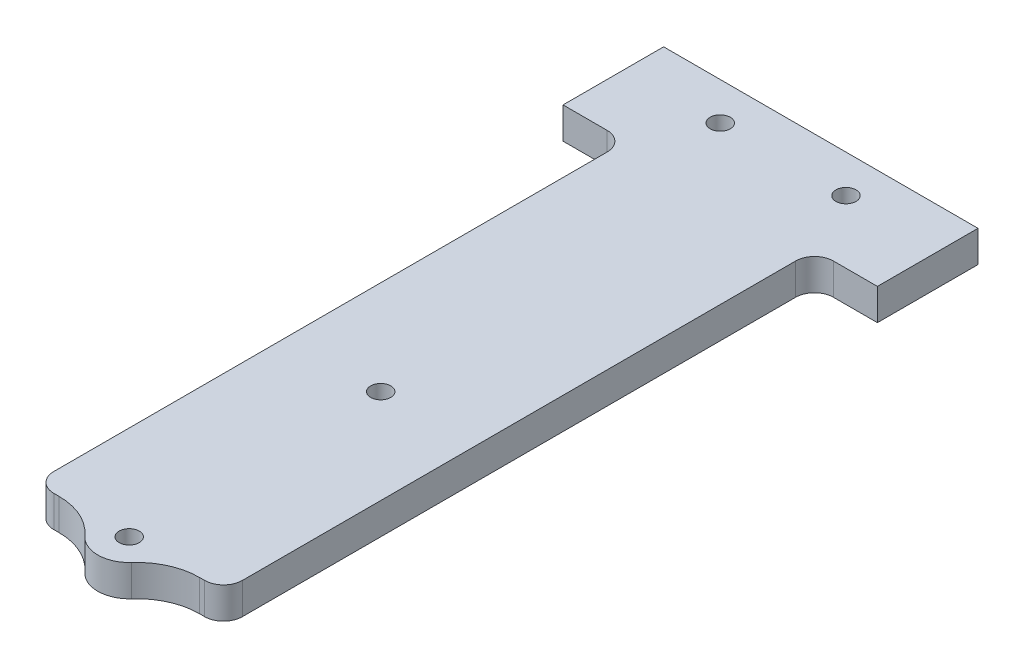
ISO-10303-21;
HEADER;
FILE_DESCRIPTION(('STEP AP214'),'2;1');
FILE_NAME('part.step','',(''),(''),'','','');
FILE_SCHEMA(('AUTOMOTIVE_DESIGN { 1 0 10303 214 1 1 1 1 }'));
ENDSEC;
DATA;
#1=APPLICATION_CONTEXT('core data for automotive mechanical design processes');
#2=APPLICATION_PROTOCOL_DEFINITION('international standard','automotive_design',2000,#1);
#3=PRODUCT_CONTEXT('',#1,'mechanical');
#4=PRODUCT('Part','Part','',(#3));
#5=PRODUCT_RELATED_PRODUCT_CATEGORY('part','',(#4));
#6=PRODUCT_DEFINITION_FORMATION('','',#4);
#7=PRODUCT_DEFINITION_CONTEXT('part definition',#1,'design');
#8=PRODUCT_DEFINITION('design','',#6,#7);
#9=PRODUCT_DEFINITION_SHAPE('','',#8);
#10=(LENGTH_UNIT() NAMED_UNIT(*) SI_UNIT(.MILLI.,.METRE.));
#11=(NAMED_UNIT(*) PLANE_ANGLE_UNIT() SI_UNIT($,.RADIAN.));
#12=(NAMED_UNIT(*) SI_UNIT($,.STERADIAN.) SOLID_ANGLE_UNIT());
#13=UNCERTAINTY_MEASURE_WITH_UNIT(LENGTH_MEASURE(1.E-05),#10,'distance_accuracy_value','');
#14=(GEOMETRIC_REPRESENTATION_CONTEXT(3) GLOBAL_UNCERTAINTY_ASSIGNED_CONTEXT((#13)) GLOBAL_UNIT_ASSIGNED_CONTEXT((#10,
#11,#12)) REPRESENTATION_CONTEXT('',''));
#15=CARTESIAN_POINT('',(0.,0.,0.));
#16=DIRECTION('',(0.,0.,1.));
#17=DIRECTION('',(1.,0.,0.));
#18=AXIS2_PLACEMENT_3D('',#15,#16,#17);
#19=CARTESIAN_POINT('',(0.,5.,0.));
#20=DIRECTION('',(1.,0.,0.));
#21=DIRECTION('',(0.,0.,-1.));
#22=AXIS2_PLACEMENT_3D('',#19,#20,#21);
#23=PLANE('',#22);
#24=DIRECTION('',(0.,0.,1.));
#25=VECTOR('',#24,1.);
#26=CARTESIAN_POINT('',(0.,5.,0.));
#27=LINE('',#26,#25);
#28=CARTESIAN_POINT('',(0.,5.,-91.));
#29=VERTEX_POINT('',#28);
#30=CARTESIAN_POINT('',(0.,5.,-3.));
#31=VERTEX_POINT('',#30);
#32=EDGE_CURVE('E58',#29,#31,#27,.T.);
#33=ORIENTED_EDGE('',*,*,#32,.F.);
#34=DIRECTION('',(0.,1.,0.));
#35=VECTOR('',#34,1.);
#36=CARTESIAN_POINT('',(0.,0.,-91.));
#37=LINE('',#36,#35);
#38=CARTESIAN_POINT('',(0.,0.,-91.));
#39=VERTEX_POINT('',#38);
#40=EDGE_CURVE('E271',#29,#39,#37,.F.);
#41=ORIENTED_EDGE('',*,*,#40,.T.);
#42=DIRECTION('',(0.,0.,1.));
#43=VECTOR('',#42,1.);
#44=CARTESIAN_POINT('',(0.,0.,0.));
#45=LINE('',#44,#43);
#46=CARTESIAN_POINT('',(0.,0.,-3.));
#47=VERTEX_POINT('',#46);
#48=EDGE_CURVE('E188',#39,#47,#45,.T.);
#49=ORIENTED_EDGE('',*,*,#48,.T.);
#50=DIRECTION('',(0.,-1.,0.));
#51=VECTOR('',#50,1.);
#52=CARTESIAN_POINT('',(0.,5.,-3.));
#53=LINE('',#52,#51);
#54=EDGE_CURVE('E268',#47,#31,#53,.F.);
#55=ORIENTED_EDGE('',*,*,#54,.T.);
#56=EDGE_LOOP('',(#33,#41,#49,#55));
#57=FACE_BOUND('',#56,.T.);
#58=ADVANCED_FACE('F42',(#57),#23,.F.);
#59=CARTESIAN_POINT('',(30.,5.,0.));
#60=DIRECTION('',(-1.,0.,0.));
#61=DIRECTION('',(0.,0.,1.));
#62=AXIS2_PLACEMENT_3D('',#59,#60,#61);
#63=PLANE('',#62);
#64=DIRECTION('',(0.,0.,-1.));
#65=VECTOR('',#64,1.);
#66=CARTESIAN_POINT('',(30.,5.,0.));
#67=LINE('',#66,#65);
#68=CARTESIAN_POINT('',(30.,5.,-3.));
#69=VERTEX_POINT('',#68);
#70=CARTESIAN_POINT('',(30.,5.,-91.));
#71=VERTEX_POINT('',#70);
#72=EDGE_CURVE('E202',#69,#71,#67,.T.);
#73=ORIENTED_EDGE('',*,*,#72,.F.);
#74=DIRECTION('',(0.,-1.,0.));
#75=VECTOR('',#74,1.);
#76=CARTESIAN_POINT('',(30.,5.,-3.));
#77=LINE('',#76,#75);
#78=CARTESIAN_POINT('',(30.,0.,-3.));
#79=VERTEX_POINT('',#78);
#80=EDGE_CURVE('E257',#69,#79,#77,.T.);
#81=ORIENTED_EDGE('',*,*,#80,.T.);
#82=DIRECTION('',(0.,0.,-1.));
#83=VECTOR('',#82,1.);
#84=CARTESIAN_POINT('',(30.,0.,0.));
#85=LINE('',#84,#83);
#86=CARTESIAN_POINT('',(30.,0.,-91.));
#87=VERTEX_POINT('',#86);
#88=EDGE_CURVE('E214',#79,#87,#85,.T.);
#89=ORIENTED_EDGE('',*,*,#88,.T.);
#90=DIRECTION('',(0.,-1.,0.));
#91=VECTOR('',#90,1.);
#92=CARTESIAN_POINT('',(30.,5.,-91.));
#93=LINE('',#92,#91);
#94=EDGE_CURVE('E261',#87,#71,#93,.F.);
#95=ORIENTED_EDGE('',*,*,#94,.T.);
#96=EDGE_LOOP('',(#73,#81,#89,#95));
#97=FACE_BOUND('',#96,.T.);
#98=ADVANCED_FACE('F343',(#97),#63,.F.);
#99=CARTESIAN_POINT('',(0.,5.,0.));
#100=DIRECTION('',(0.,-1.,0.));
#101=DIRECTION('',(0.,0.,-1.));
#102=AXIS2_PLACEMENT_3D('',#99,#100,#101);
#103=PLANE('',#102);
#104=DIRECTION('',(0.,0.,-1.));
#105=VECTOR('',#104,1.);
#106=CARTESIAN_POINT('',(40.,5.,-94.));
#107=LINE('',#106,#105);
#108=CARTESIAN_POINT('',(40.,5.,-94.));
#109=VERTEX_POINT('',#108);
#110=CARTESIAN_POINT('',(40.,5.,-110.));
#111=VERTEX_POINT('',#110);
#112=EDGE_CURVE('E156',#109,#111,#107,.T.);
#113=ORIENTED_EDGE('',*,*,#112,.T.);
#114=DIRECTION('',(1.,0.,0.));
#115=VECTOR('',#114,1.);
#116=CARTESIAN_POINT('',(-10.,5.,-110.));
#117=LINE('',#116,#115);
#118=CARTESIAN_POINT('',(-10.,5.,-110.));
#119=VERTEX_POINT('',#118);
#120=EDGE_CURVE('E161',#119,#111,#117,.T.);
#121=ORIENTED_EDGE('',*,*,#120,.F.);
#122=DIRECTION('',(0.,0.,-1.));
#123=VECTOR('',#122,1.);
#124=CARTESIAN_POINT('',(-10.,5.,-94.));
#125=LINE('',#124,#123);
#126=CARTESIAN_POINT('',(-10.,5.,-94.));
#127=VERTEX_POINT('',#126);
#128=EDGE_CURVE('E168',#127,#119,#125,.T.);
#129=ORIENTED_EDGE('',*,*,#128,.F.);
#130=DIRECTION('',(-1.,0.,0.));
#131=VECTOR('',#130,1.);
#132=CARTESIAN_POINT('',(-10.,5.,-94.));
#133=LINE('',#132,#131);
#134=CARTESIAN_POINT('',(-3.,5.,-94.));
#135=VERTEX_POINT('',#134);
#136=EDGE_CURVE('E296',#135,#127,#133,.T.);
#137=ORIENTED_EDGE('',*,*,#136,.F.);
#138=CARTESIAN_POINT('',(-3.,5.,-91.));
#139=DIRECTION('',(0.,-1.,0.));
#140=DIRECTION('',(0.,0.,-1.));
#141=AXIS2_PLACEMENT_3D('',#138,#139,#140);
#142=CIRCLE('',#141,3.);
#143=EDGE_CURVE('E51',#135,#29,#142,.T.);
#144=ORIENTED_EDGE('',*,*,#143,.T.);
#145=ORIENTED_EDGE('',*,*,#32,.T.);
#146=CARTESIAN_POINT('',(3.,5.,-3.));
#147=DIRECTION('',(0.,-1.,0.));
#148=DIRECTION('',(0.,0.,-1.));
#149=AXIS2_PLACEMENT_3D('',#146,#147,#148);
#150=CIRCLE('',#149,3.);
#151=CARTESIAN_POINT('',(3.,5.,0.));
#152=VERTEX_POINT('',#151);
#153=EDGE_CURVE('E251',#31,#152,#150,.F.);
#154=ORIENTED_EDGE('',*,*,#153,.T.);
#155=DIRECTION('',(1.,0.,0.));
#156=VECTOR('',#155,1.);
#157=CARTESIAN_POINT('',(0.,5.,0.));
#158=LINE('',#157,#156);
#159=CARTESIAN_POINT('',(3.81966011250105,5.,0.));
#160=VERTEX_POINT('',#159);
#161=EDGE_CURVE('E199',#152,#160,#158,.T.);
#162=ORIENTED_EDGE('',*,*,#161,.T.);
#163=CARTESIAN_POINT('',(3.81966011250105,5.,10.));
#164=DIRECTION('',(0.,-1.,0.));
#165=DIRECTION('',(0.,0.,-1.));
#166=AXIS2_PLACEMENT_3D('',#163,#164,#165);
#167=CIRCLE('',#166,10.);
#168=CARTESIAN_POINT('',(11.2732200375003,4.99999999999998,3.33333333333333));
#169=VERTEX_POINT('',#168);
#170=EDGE_CURVE('E240',#160,#169,#167,.T.);
#171=ORIENTED_EDGE('',*,*,#170,.T.);
#172=CARTESIAN_POINT('',(15.,4.99999999999998,0.));
#173=DIRECTION('',(0.,-1.,0.));
#174=DIRECTION('',(0.,0.,-1.));
#175=AXIS2_PLACEMENT_3D('',#172,#173,#174);
#176=CIRCLE('',#175,5.);
#177=CARTESIAN_POINT('',(18.7267799624996,4.99999999999998,3.33333333333333));
#178=VERTEX_POINT('',#177);
#179=EDGE_CURVE('E177',#169,#178,#176,.F.);
#180=ORIENTED_EDGE('',*,*,#179,.T.);
#181=CARTESIAN_POINT('',(26.1803398874989,5.,10.));
#182=DIRECTION('',(0.,-1.,0.));
#183=DIRECTION('',(0.,0.,-1.));
#184=AXIS2_PLACEMENT_3D('',#181,#182,#183);
#185=CIRCLE('',#184,10.);
#186=CARTESIAN_POINT('',(26.1803398874989,5.,0.));
#187=VERTEX_POINT('',#186);
#188=EDGE_CURVE('E237',#178,#187,#185,.T.);
#189=ORIENTED_EDGE('',*,*,#188,.T.);
#190=CARTESIAN_POINT('',(27.,5.,0.));
#191=VERTEX_POINT('',#190);
#192=EDGE_CURVE('E197',#187,#191,#158,.T.);
#193=ORIENTED_EDGE('',*,*,#192,.T.);
#194=CARTESIAN_POINT('',(27.,5.,-3.));
#195=DIRECTION('',(0.,-1.,0.));
#196=DIRECTION('',(0.,0.,-1.));
#197=AXIS2_PLACEMENT_3D('',#194,#195,#196);
#198=CIRCLE('',#197,3.);
#199=EDGE_CURVE('E247',#191,#69,#198,.F.);
#200=ORIENTED_EDGE('',*,*,#199,.T.);
#201=ORIENTED_EDGE('',*,*,#72,.T.);
#202=CARTESIAN_POINT('',(33.,5.,-91.));
#203=DIRECTION('',(0.,-1.,0.));
#204=DIRECTION('',(0.,0.,-1.));
#205=AXIS2_PLACEMENT_3D('',#202,#203,#204);
#206=CIRCLE('',#205,3.);
#207=CARTESIAN_POINT('',(33.,5.,-94.));
#208=VERTEX_POINT('',#207);
#209=EDGE_CURVE('E290',#71,#208,#206,.T.);
#210=ORIENTED_EDGE('',*,*,#209,.T.);
#211=EDGE_CURVE('E66',#109,#208,#133,.T.);
#212=ORIENTED_EDGE('',*,*,#211,.F.);
#213=EDGE_LOOP('',(#113,#121,#129,#137,#144,#145,#154,#162,#171,#180,#189,#193,#200,#201,#210,#212));
#214=FACE_BOUND('',#213,.T.);
#215=CARTESIAN_POINT('',(4.99999999999999,5.,-104.));
#216=DIRECTION('',(0.,-1.,0.));
#217=DIRECTION('',(0.,0.,-1.));
#218=AXIS2_PLACEMENT_3D('',#215,#216,#217);
#219=CIRCLE('',#218,1.6);
#220=CARTESIAN_POINT('',(4.99999999999999,5.,-105.6));
#221=VERTEX_POINT('',#220);
#222=EDGE_CURVE('E397',#221,#221,#219,.F.);
#223=ORIENTED_EDGE('',*,*,#222,.F.);
#224=EDGE_LOOP('',(#223));
#225=FACE_BOUND('',#224,.T.);
#226=CARTESIAN_POINT('',(15.,4.99999999999999,-40.));
#227=DIRECTION('',(0.,-1.,0.));
#228=DIRECTION('',(0.,0.,-1.));
#229=AXIS2_PLACEMENT_3D('',#226,#227,#228);
#230=CIRCLE('',#229,1.6);
#231=CARTESIAN_POINT('',(15.,4.99999999999999,-41.6));
#232=VERTEX_POINT('',#231);
#233=EDGE_CURVE('E401',#232,#232,#230,.F.);
#234=ORIENTED_EDGE('',*,*,#233,.F.);
#235=EDGE_LOOP('',(#234));
#236=FACE_BOUND('',#235,.T.);
#237=CARTESIAN_POINT('',(25.,5.,-104.));
#238=DIRECTION('',(0.,-1.,0.));
#239=DIRECTION('',(0.,0.,-1.));
#240=AXIS2_PLACEMENT_3D('',#237,#238,#239);
#241=CIRCLE('',#240,1.60000000000001);
#242=CARTESIAN_POINT('',(25.,5.,-105.6));
#243=VERTEX_POINT('',#242);
#244=EDGE_CURVE('E387',#243,#243,#241,.F.);
#245=ORIENTED_EDGE('',*,*,#244,.F.);
#246=EDGE_LOOP('',(#245));
#247=FACE_BOUND('',#246,.T.);
#248=CARTESIAN_POINT('',(15.,4.99999999999998,0.));
#249=DIRECTION('',(0.,-1.,0.));
#250=DIRECTION('',(0.,0.,-1.));
#251=AXIS2_PLACEMENT_3D('',#248,#249,#250);
#252=CIRCLE('',#251,1.6);
#253=CARTESIAN_POINT('',(15.,4.99999999999998,-1.6));
#254=VERTEX_POINT('',#253);
#255=EDGE_CURVE('E405',#254,#254,#252,.F.);
#256=ORIENTED_EDGE('',*,*,#255,.F.);
#257=EDGE_LOOP('',(#256));
#258=FACE_BOUND('',#257,.T.);
#259=ADVANCED_FACE('F158',(#214,#225,#236,#247,#258),#103,.F.);
#260=CARTESIAN_POINT('',(0.,5.,0.));
#261=DIRECTION('',(0.,0.,-1.));
#262=DIRECTION('',(-1.,0.,0.));
#263=AXIS2_PLACEMENT_3D('',#260,#261,#262);
#264=PLANE('',#263);
#265=ORIENTED_EDGE('',*,*,#161,.F.);
#266=DIRECTION('',(0.,-1.,0.));
#267=VECTOR('',#266,1.);
#268=CARTESIAN_POINT('',(3.,5.,0.));
#269=LINE('',#268,#267);
#270=CARTESIAN_POINT('',(3.,0.,0.));
#271=VERTEX_POINT('',#270);
#272=EDGE_CURVE('E274',#152,#271,#269,.T.);
#273=ORIENTED_EDGE('',*,*,#272,.T.);
#274=DIRECTION('',(1.,0.,0.));
#275=VECTOR('',#274,1.);
#276=CARTESIAN_POINT('',(0.,0.,0.));
#277=LINE('',#276,#275);
#278=CARTESIAN_POINT('',(3.81966011250105,0.,0.));
#279=VERTEX_POINT('',#278);
#280=EDGE_CURVE('E211',#271,#279,#277,.T.);
#281=ORIENTED_EDGE('',*,*,#280,.T.);
#282=DIRECTION('',(0.,1.,0.));
#283=VECTOR('',#282,1.);
#284=CARTESIAN_POINT('',(3.81966011250105,5.,0.));
#285=LINE('',#284,#283);
#286=EDGE_CURVE('E230',#279,#160,#285,.T.);
#287=ORIENTED_EDGE('',*,*,#286,.T.);
#288=EDGE_LOOP('',(#265,#273,#281,#287));
#289=FACE_BOUND('',#288,.T.);
#290=ADVANCED_FACE('F313',(#289),#264,.F.);
#291=CARTESIAN_POINT('',(26.1803398874989,0.,0.));
#292=VERTEX_POINT('',#291);
#293=CARTESIAN_POINT('',(27.,0.,0.));
#294=VERTEX_POINT('',#293);
#295=EDGE_CURVE('E210',#292,#294,#277,.T.);
#296=ORIENTED_EDGE('',*,*,#295,.T.);
#297=DIRECTION('',(0.,-1.,0.));
#298=VECTOR('',#297,1.);
#299=CARTESIAN_POINT('',(27.,5.,0.));
#300=LINE('',#299,#298);
#301=EDGE_CURVE('E284',#294,#191,#300,.F.);
#302=ORIENTED_EDGE('',*,*,#301,.T.);
#303=ORIENTED_EDGE('',*,*,#192,.F.);
#304=DIRECTION('',(0.,1.,0.));
#305=VECTOR('',#304,1.);
#306=CARTESIAN_POINT('',(26.1803398874989,5.,0.));
#307=LINE('',#306,#305);
#308=EDGE_CURVE('E206',#187,#292,#307,.F.);
#309=ORIENTED_EDGE('',*,*,#308,.T.);
#310=EDGE_LOOP('',(#296,#302,#303,#309));
#311=FACE_BOUND('',#310,.T.);
#312=ADVANCED_FACE('F333',(#311),#264,.F.);
#313=CARTESIAN_POINT('',(0.,5.,-110.));
#314=DIRECTION('',(0.,0.,1.));
#315=DIRECTION('',(1.,0.,0.));
#316=AXIS2_PLACEMENT_3D('',#313,#314,#315);
#317=PLANE('',#316);
#318=DIRECTION('',(0.,-1.,0.));
#319=VECTOR('',#318,1.);
#320=CARTESIAN_POINT('',(-10.,85.3587132480567,-110.));
#321=LINE('',#320,#319);
#322=CARTESIAN_POINT('',(-10.,0.,-110.));
#323=VERTEX_POINT('',#322);
#324=EDGE_CURVE('E175',#119,#323,#321,.T.);
#325=ORIENTED_EDGE('',*,*,#324,.F.);
#326=ORIENTED_EDGE('',*,*,#120,.T.);
#327=DIRECTION('',(0.,-1.,0.));
#328=VECTOR('',#327,1.);
#329=CARTESIAN_POINT('',(40.,85.3587132480567,-110.));
#330=LINE('',#329,#328);
#331=CARTESIAN_POINT('',(40.,0.,-110.));
#332=VERTEX_POINT('',#331);
#333=EDGE_CURVE('E173',#111,#332,#330,.T.);
#334=ORIENTED_EDGE('',*,*,#333,.T.);
#335=DIRECTION('',(-1.,0.,0.));
#336=VECTOR('',#335,1.);
#337=CARTESIAN_POINT('',(0.,0.,-110.));
#338=LINE('',#337,#336);
#339=EDGE_CURVE('E198',#332,#323,#338,.T.);
#340=ORIENTED_EDGE('',*,*,#339,.T.);
#341=EDGE_LOOP('',(#325,#326,#334,#340));
#342=FACE_BOUND('',#341,.T.);
#343=ADVANCED_FACE('F171',(#342),#317,.F.);
#344=CARTESIAN_POINT('',(0.,0.,0.));
#345=DIRECTION('',(0.,-1.,0.));
#346=DIRECTION('',(0.,0.,-1.));
#347=AXIS2_PLACEMENT_3D('',#344,#345,#346);
#348=PLANE('',#347);
#349=CARTESIAN_POINT('',(15.,0.,0.));
#350=DIRECTION('',(0.,1.,0.));
#351=DIRECTION('',(0.,0.,1.));
#352=AXIS2_PLACEMENT_3D('',#349,#350,#351);
#353=CIRCLE('',#352,1.6);
#354=CARTESIAN_POINT('',(15.,0.,1.6));
#355=VERTEX_POINT('',#354);
#356=EDGE_CURVE('E376',#355,#355,#353,.T.);
#357=ORIENTED_EDGE('',*,*,#356,.T.);
#358=EDGE_LOOP('',(#357));
#359=FACE_BOUND('',#358,.T.);
#360=CARTESIAN_POINT('',(15.,0.,-40.));
#361=DIRECTION('',(0.,1.,0.));
#362=DIRECTION('',(0.,0.,1.));
#363=AXIS2_PLACEMENT_3D('',#360,#361,#362);
#364=CIRCLE('',#363,1.6);
#365=CARTESIAN_POINT('',(15.,0.,-38.4));
#366=VERTEX_POINT('',#365);
#367=EDGE_CURVE('E379',#366,#366,#364,.T.);
#368=ORIENTED_EDGE('',*,*,#367,.T.);
#369=EDGE_LOOP('',(#368));
#370=FACE_BOUND('',#369,.T.);
#371=CARTESIAN_POINT('',(4.99999999999999,0.,-104.));
#372=DIRECTION('',(0.,1.,0.));
#373=DIRECTION('',(0.,0.,1.));
#374=AXIS2_PLACEMENT_3D('',#371,#372,#373);
#375=CIRCLE('',#374,1.6);
#376=CARTESIAN_POINT('',(4.99999999999999,0.,-102.4));
#377=VERTEX_POINT('',#376);
#378=EDGE_CURVE('E386',#377,#377,#375,.T.);
#379=ORIENTED_EDGE('',*,*,#378,.T.);
#380=EDGE_LOOP('',(#379));
#381=FACE_BOUND('',#380,.T.);
#382=CARTESIAN_POINT('',(25.,0.,-104.));
#383=DIRECTION('',(0.,1.,0.));
#384=DIRECTION('',(0.,0.,1.));
#385=AXIS2_PLACEMENT_3D('',#382,#383,#384);
#386=CIRCLE('',#385,1.60000000000001);
#387=CARTESIAN_POINT('',(25.,0.,-102.4));
#388=VERTEX_POINT('',#387);
#389=EDGE_CURVE('E382',#388,#388,#386,.T.);
#390=ORIENTED_EDGE('',*,*,#389,.T.);
#391=EDGE_LOOP('',(#390));
#392=FACE_BOUND('',#391,.T.);
#393=ORIENTED_EDGE('',*,*,#280,.F.);
#394=CARTESIAN_POINT('',(3.,0.,-3.));
#395=DIRECTION('',(0.,-1.,0.));
#396=DIRECTION('',(0.,0.,-1.));
#397=AXIS2_PLACEMENT_3D('',#394,#395,#396);
#398=CIRCLE('',#397,3.);
#399=EDGE_CURVE('E281',#271,#47,#398,.T.);
#400=ORIENTED_EDGE('',*,*,#399,.T.);
#401=ORIENTED_EDGE('',*,*,#48,.F.);
#402=CARTESIAN_POINT('',(-3.,0.,-91.));
#403=DIRECTION('',(0.,-1.,0.));
#404=DIRECTION('',(0.,0.,-1.));
#405=AXIS2_PLACEMENT_3D('',#402,#403,#404);
#406=CIRCLE('',#405,3.);
#407=CARTESIAN_POINT('',(-3.,0.,-94.));
#408=VERTEX_POINT('',#407);
#409=EDGE_CURVE('E11',#39,#408,#406,.F.);
#410=ORIENTED_EDGE('',*,*,#409,.T.);
#411=DIRECTION('',(1.,0.,0.));
#412=VECTOR('',#411,1.);
#413=CARTESIAN_POINT('',(-10.,0.,-94.));
#414=LINE('',#413,#412);
#415=CARTESIAN_POINT('',(-10.,0.,-94.));
#416=VERTEX_POINT('',#415);
#417=EDGE_CURVE('E354',#416,#408,#414,.T.);
#418=ORIENTED_EDGE('',*,*,#417,.F.);
#419=DIRECTION('',(0.,0.,1.));
#420=VECTOR('',#419,1.);
#421=CARTESIAN_POINT('',(-10.,0.,-110.));
#422=LINE('',#421,#420);
#423=EDGE_CURVE('E190',#323,#416,#422,.T.);
#424=ORIENTED_EDGE('',*,*,#423,.F.);
#425=ORIENTED_EDGE('',*,*,#339,.F.);
#426=DIRECTION('',(0.,0.,-1.));
#427=VECTOR('',#426,1.);
#428=CARTESIAN_POINT('',(40.,0.,-110.));
#429=LINE('',#428,#427);
#430=CARTESIAN_POINT('',(40.,0.,-94.));
#431=VERTEX_POINT('',#430);
#432=EDGE_CURVE('E167',#431,#332,#429,.T.);
#433=ORIENTED_EDGE('',*,*,#432,.F.);
#434=CARTESIAN_POINT('',(33.,0.,-94.));
#435=VERTEX_POINT('',#434);
#436=EDGE_CURVE('E346',#435,#431,#414,.T.);
#437=ORIENTED_EDGE('',*,*,#436,.F.);
#438=CARTESIAN_POINT('',(33.,0.,-91.));
#439=DIRECTION('',(0.,-1.,0.));
#440=DIRECTION('',(0.,0.,-1.));
#441=AXIS2_PLACEMENT_3D('',#438,#439,#440);
#442=CIRCLE('',#441,3.);
#443=EDGE_CURVE('E287',#435,#87,#442,.F.);
#444=ORIENTED_EDGE('',*,*,#443,.T.);
#445=ORIENTED_EDGE('',*,*,#88,.F.);
#446=CARTESIAN_POINT('',(27.,0.,-3.));
#447=DIRECTION('',(0.,-1.,0.));
#448=DIRECTION('',(0.,0.,-1.));
#449=AXIS2_PLACEMENT_3D('',#446,#447,#448);
#450=CIRCLE('',#449,3.);
#451=EDGE_CURVE('E278',#79,#294,#450,.T.);
#452=ORIENTED_EDGE('',*,*,#451,.T.);
#453=ORIENTED_EDGE('',*,*,#295,.F.);
#454=CARTESIAN_POINT('',(26.1803398874989,0.,10.));
#455=DIRECTION('',(0.,-1.,0.));
#456=DIRECTION('',(0.,0.,-1.));
#457=AXIS2_PLACEMENT_3D('',#454,#455,#456);
#458=CIRCLE('',#457,10.);
#459=CARTESIAN_POINT('',(18.7267799624996,0.,3.33333333333333));
#460=VERTEX_POINT('',#459);
#461=EDGE_CURVE('E234',#292,#460,#458,.F.);
#462=ORIENTED_EDGE('',*,*,#461,.T.);
#463=CARTESIAN_POINT('',(15.,0.,0.));
#464=DIRECTION('',(0.,-1.,0.));
#465=DIRECTION('',(0.,0.,-1.));
#466=AXIS2_PLACEMENT_3D('',#463,#464,#465);
#467=CIRCLE('',#466,5.);
#468=CARTESIAN_POINT('',(11.2732200375003,0.,3.33333333333333));
#469=VERTEX_POINT('',#468);
#470=EDGE_CURVE('E183',#469,#460,#467,.F.);
#471=ORIENTED_EDGE('',*,*,#470,.F.);
#472=CARTESIAN_POINT('',(3.81966011250105,0.,10.));
#473=DIRECTION('',(0.,-1.,0.));
#474=DIRECTION('',(0.,0.,-1.));
#475=AXIS2_PLACEMENT_3D('',#472,#473,#474);
#476=CIRCLE('',#475,10.);
#477=EDGE_CURVE('E243',#469,#279,#476,.F.);
#478=ORIENTED_EDGE('',*,*,#477,.T.);
#479=EDGE_LOOP('',(#393,#400,#401,#410,#418,#424,#425,#433,#437,#444,#445,#452,#453,#462,#471,#478));
#480=FACE_BOUND('',#479,.T.);
#481=ADVANCED_FACE('F305',(#359,#370,#381,#392,#480),#348,.T.);
#482=CARTESIAN_POINT('',(15.,-14.142135623731,0.));
#483=DIRECTION('',(0.,1.,0.));
#484=DIRECTION('',(0.,0.,1.));
#485=AXIS2_PLACEMENT_3D('',#482,#483,#484);
#486=CYLINDRICAL_SURFACE('',#485,5.);
#487=DIRECTION('',(0.,1.,0.));
#488=VECTOR('',#487,1.);
#489=CARTESIAN_POINT('',(18.7267799624996,-14.142135623731,3.33333333333333));
#490=LINE('',#489,#488);
#491=EDGE_CURVE('E226',#460,#178,#490,.T.);
#492=ORIENTED_EDGE('',*,*,#491,.T.);
#493=ORIENTED_EDGE('',*,*,#179,.F.);
#494=DIRECTION('',(0.,1.,0.));
#495=VECTOR('',#494,1.);
#496=CARTESIAN_POINT('',(11.2732200375003,-14.142135623731,3.33333333333333));
#497=LINE('',#496,#495);
#498=EDGE_CURVE('E223',#169,#469,#497,.F.);
#499=ORIENTED_EDGE('',*,*,#498,.T.);
#500=ORIENTED_EDGE('',*,*,#470,.T.);
#501=EDGE_LOOP('',(#492,#493,#499,#500));
#502=FACE_BOUND('',#501,.T.);
#503=ADVANCED_FACE('F323',(#502),#486,.T.);
#504=CARTESIAN_POINT('',(-10.,85.3587132480567,-110.));
#505=DIRECTION('',(1.,0.,0.));
#506=DIRECTION('',(0.,0.,-1.));
#507=AXIS2_PLACEMENT_3D('',#504,#505,#506);
#508=PLANE('',#507);
#509=ORIENTED_EDGE('',*,*,#128,.T.);
#510=ORIENTED_EDGE('',*,*,#324,.T.);
#511=ORIENTED_EDGE('',*,*,#423,.T.);
#512=DIRECTION('',(0.,-1.,0.));
#513=VECTOR('',#512,1.);
#514=CARTESIAN_POINT('',(-10.,0.,-94.));
#515=LINE('',#514,#513);
#516=EDGE_CURVE('E355',#127,#416,#515,.T.);
#517=ORIENTED_EDGE('',*,*,#516,.F.);
#518=EDGE_LOOP('',(#509,#510,#511,#517));
#519=FACE_BOUND('',#518,.T.);
#520=ADVANCED_FACE('F371',(#519),#508,.F.);
#521=CARTESIAN_POINT('',(40.,85.3587132480567,-110.));
#522=DIRECTION('',(-1.,0.,0.));
#523=DIRECTION('',(0.,0.,1.));
#524=AXIS2_PLACEMENT_3D('',#521,#522,#523);
#525=PLANE('',#524);
#526=ORIENTED_EDGE('',*,*,#333,.F.);
#527=ORIENTED_EDGE('',*,*,#112,.F.);
#528=DIRECTION('',(0.,1.,0.));
#529=VECTOR('',#528,1.);
#530=CARTESIAN_POINT('',(40.,0.,-94.));
#531=LINE('',#530,#529);
#532=EDGE_CURVE('E352',#431,#109,#531,.T.);
#533=ORIENTED_EDGE('',*,*,#532,.F.);
#534=ORIENTED_EDGE('',*,*,#432,.T.);
#535=EDGE_LOOP('',(#526,#527,#533,#534));
#536=FACE_BOUND('',#535,.T.);
#537=ADVANCED_FACE('F180',(#536),#525,.F.);
#538=CARTESIAN_POINT('',(0.,0.,-94.));
#539=DIRECTION('',(0.,0.,-1.));
#540=DIRECTION('',(-1.,0.,0.));
#541=AXIS2_PLACEMENT_3D('',#538,#539,#540);
#542=PLANE('',#541);
#543=ORIENTED_EDGE('',*,*,#211,.T.);
#544=DIRECTION('',(0.,-1.,0.));
#545=VECTOR('',#544,1.);
#546=CARTESIAN_POINT('',(33.,0.,-94.));
#547=LINE('',#546,#545);
#548=EDGE_CURVE('E254',#208,#435,#547,.T.);
#549=ORIENTED_EDGE('',*,*,#548,.T.);
#550=ORIENTED_EDGE('',*,*,#436,.T.);
#551=ORIENTED_EDGE('',*,*,#532,.T.);
#552=EDGE_LOOP('',(#543,#549,#550,#551));
#553=FACE_BOUND('',#552,.T.);
#554=ADVANCED_FACE('F351',(#553),#542,.F.);
#555=ORIENTED_EDGE('',*,*,#417,.T.);
#556=DIRECTION('',(0.,1.,0.));
#557=VECTOR('',#556,1.);
#558=CARTESIAN_POINT('',(-3.,5.,-94.));
#559=LINE('',#558,#557);
#560=EDGE_CURVE('E264',#408,#135,#559,.T.);
#561=ORIENTED_EDGE('',*,*,#560,.T.);
#562=ORIENTED_EDGE('',*,*,#136,.T.);
#563=ORIENTED_EDGE('',*,*,#516,.T.);
#564=EDGE_LOOP('',(#555,#561,#562,#563));
#565=FACE_BOUND('',#564,.T.);
#566=ADVANCED_FACE('F374',(#565),#542,.F.);
#567=CARTESIAN_POINT('',(25.,0.,-104.));
#568=DIRECTION('',(0.,1.,0.));
#569=DIRECTION('',(0.,0.,1.));
#570=AXIS2_PLACEMENT_3D('',#567,#568,#569);
#571=CYLINDRICAL_SURFACE('',#570,1.60000000000001);
#572=ORIENTED_EDGE('',*,*,#244,.T.);
#573=EDGE_LOOP('',(#572));
#574=FACE_BOUND('',#573,.T.);
#575=ORIENTED_EDGE('',*,*,#389,.F.);
#576=EDGE_LOOP('',(#575));
#577=FACE_BOUND('',#576,.T.);
#578=ADVANCED_FACE('F512',(#574,#577),#571,.F.);
#579=CARTESIAN_POINT('',(4.99999999999999,0.,-104.));
#580=DIRECTION('',(0.,1.,0.));
#581=DIRECTION('',(0.,0.,1.));
#582=AXIS2_PLACEMENT_3D('',#579,#580,#581);
#583=CYLINDRICAL_SURFACE('',#582,1.6);
#584=ORIENTED_EDGE('',*,*,#222,.T.);
#585=EDGE_LOOP('',(#584));
#586=FACE_BOUND('',#585,.T.);
#587=ORIENTED_EDGE('',*,*,#378,.F.);
#588=EDGE_LOOP('',(#587));
#589=FACE_BOUND('',#588,.T.);
#590=ADVANCED_FACE('F517',(#586,#589),#583,.F.);
#591=CARTESIAN_POINT('',(15.,0.,-40.));
#592=DIRECTION('',(0.,1.,0.));
#593=DIRECTION('',(0.,0.,1.));
#594=AXIS2_PLACEMENT_3D('',#591,#592,#593);
#595=CYLINDRICAL_SURFACE('',#594,1.6);
#596=ORIENTED_EDGE('',*,*,#233,.T.);
#597=EDGE_LOOP('',(#596));
#598=FACE_BOUND('',#597,.T.);
#599=ORIENTED_EDGE('',*,*,#367,.F.);
#600=EDGE_LOOP('',(#599));
#601=FACE_BOUND('',#600,.T.);
#602=ADVANCED_FACE('F530',(#598,#601),#595,.F.);
#603=CARTESIAN_POINT('',(15.,0.,0.));
#604=DIRECTION('',(0.,1.,0.));
#605=DIRECTION('',(0.,0.,1.));
#606=AXIS2_PLACEMENT_3D('',#603,#604,#605);
#607=CYLINDRICAL_SURFACE('',#606,1.6);
#608=ORIENTED_EDGE('',*,*,#255,.T.);
#609=EDGE_LOOP('',(#608));
#610=FACE_BOUND('',#609,.T.);
#611=ORIENTED_EDGE('',*,*,#356,.F.);
#612=EDGE_LOOP('',(#611));
#613=FACE_BOUND('',#612,.T.);
#614=ADVANCED_FACE('F412',(#610,#613),#607,.F.);
#615=CARTESIAN_POINT('',(26.1803398874989,-14.142135623731,10.));
#616=DIRECTION('',(0.,1.,0.));
#617=DIRECTION('',(0.,0.,1.));
#618=AXIS2_PLACEMENT_3D('',#615,#616,#617);
#619=CYLINDRICAL_SURFACE('',#618,10.);
#620=ORIENTED_EDGE('',*,*,#188,.F.);
#621=ORIENTED_EDGE('',*,*,#491,.F.);
#622=ORIENTED_EDGE('',*,*,#461,.F.);
#623=ORIENTED_EDGE('',*,*,#308,.F.);
#624=EDGE_LOOP('',(#620,#621,#622,#623));
#625=FACE_BOUND('',#624,.T.);
#626=ADVANCED_FACE('F330',(#625),#619,.F.);
#627=CARTESIAN_POINT('',(3.81966011250105,-14.142135623731,10.));
#628=DIRECTION('',(0.,1.,0.));
#629=DIRECTION('',(0.,0.,1.));
#630=AXIS2_PLACEMENT_3D('',#627,#628,#629);
#631=CYLINDRICAL_SURFACE('',#630,10.);
#632=ORIENTED_EDGE('',*,*,#498,.F.);
#633=ORIENTED_EDGE('',*,*,#170,.F.);
#634=ORIENTED_EDGE('',*,*,#286,.F.);
#635=ORIENTED_EDGE('',*,*,#477,.F.);
#636=EDGE_LOOP('',(#632,#633,#634,#635));
#637=FACE_BOUND('',#636,.T.);
#638=ADVANCED_FACE('F319',(#637),#631,.F.);
#639=CARTESIAN_POINT('',(33.,0.,-91.));
#640=DIRECTION('',(0.,1.,0.));
#641=DIRECTION('',(0.,0.,1.));
#642=AXIS2_PLACEMENT_3D('',#639,#640,#641);
#643=CYLINDRICAL_SURFACE('',#642,3.);
#644=ORIENTED_EDGE('',*,*,#209,.F.);
#645=ORIENTED_EDGE('',*,*,#94,.F.);
#646=ORIENTED_EDGE('',*,*,#443,.F.);
#647=ORIENTED_EDGE('',*,*,#548,.F.);
#648=EDGE_LOOP('',(#644,#645,#646,#647));
#649=FACE_BOUND('',#648,.T.);
#650=ADVANCED_FACE('F350',(#649),#643,.F.);
#651=CARTESIAN_POINT('',(-3.,0.,-91.));
#652=DIRECTION('',(0.,-1.,0.));
#653=DIRECTION('',(0.,0.,-1.));
#654=AXIS2_PLACEMENT_3D('',#651,#652,#653);
#655=CYLINDRICAL_SURFACE('',#654,3.);
#656=ORIENTED_EDGE('',*,*,#409,.F.);
#657=ORIENTED_EDGE('',*,*,#40,.F.);
#658=ORIENTED_EDGE('',*,*,#143,.F.);
#659=ORIENTED_EDGE('',*,*,#560,.F.);
#660=EDGE_LOOP('',(#656,#657,#658,#659));
#661=FACE_BOUND('',#660,.T.);
#662=ADVANCED_FACE('F300',(#661),#655,.F.);
#663=CARTESIAN_POINT('',(3.,5.,-3.));
#664=DIRECTION('',(0.,-1.,0.));
#665=DIRECTION('',(0.,0.,-1.));
#666=AXIS2_PLACEMENT_3D('',#663,#664,#665);
#667=CYLINDRICAL_SURFACE('',#666,3.);
#668=ORIENTED_EDGE('',*,*,#153,.F.);
#669=ORIENTED_EDGE('',*,*,#54,.F.);
#670=ORIENTED_EDGE('',*,*,#399,.F.);
#671=ORIENTED_EDGE('',*,*,#272,.F.);
#672=EDGE_LOOP('',(#668,#669,#670,#671));
#673=FACE_BOUND('',#672,.T.);
#674=ADVANCED_FACE('F310',(#673),#667,.T.);
#675=CARTESIAN_POINT('',(27.,5.,-3.));
#676=DIRECTION('',(0.,-1.,0.));
#677=DIRECTION('',(0.,0.,-1.));
#678=AXIS2_PLACEMENT_3D('',#675,#676,#677);
#679=CYLINDRICAL_SURFACE('',#678,3.);
#680=ORIENTED_EDGE('',*,*,#199,.F.);
#681=ORIENTED_EDGE('',*,*,#301,.F.);
#682=ORIENTED_EDGE('',*,*,#451,.F.);
#683=ORIENTED_EDGE('',*,*,#80,.F.);
#684=EDGE_LOOP('',(#680,#681,#682,#683));
#685=FACE_BOUND('',#684,.T.);
#686=ADVANCED_FACE('F44',(#685),#679,.T.);
#687=CLOSED_SHELL('',(#58,#98,#259,#290,#312,#343,#481,#503,#520,#537,#554,#566,#578,#590,#602,
#614,#626,#638,#650,#662,#674,#686));
#688=MANIFOLD_SOLID_BREP('B2',#687);
#689=ADVANCED_BREP_SHAPE_REPRESENTATION('',(#18,#688),#14);
#690=SHAPE_DEFINITION_REPRESENTATION(#9,#689);
ENDSEC;
END-ISO-10303-21;
